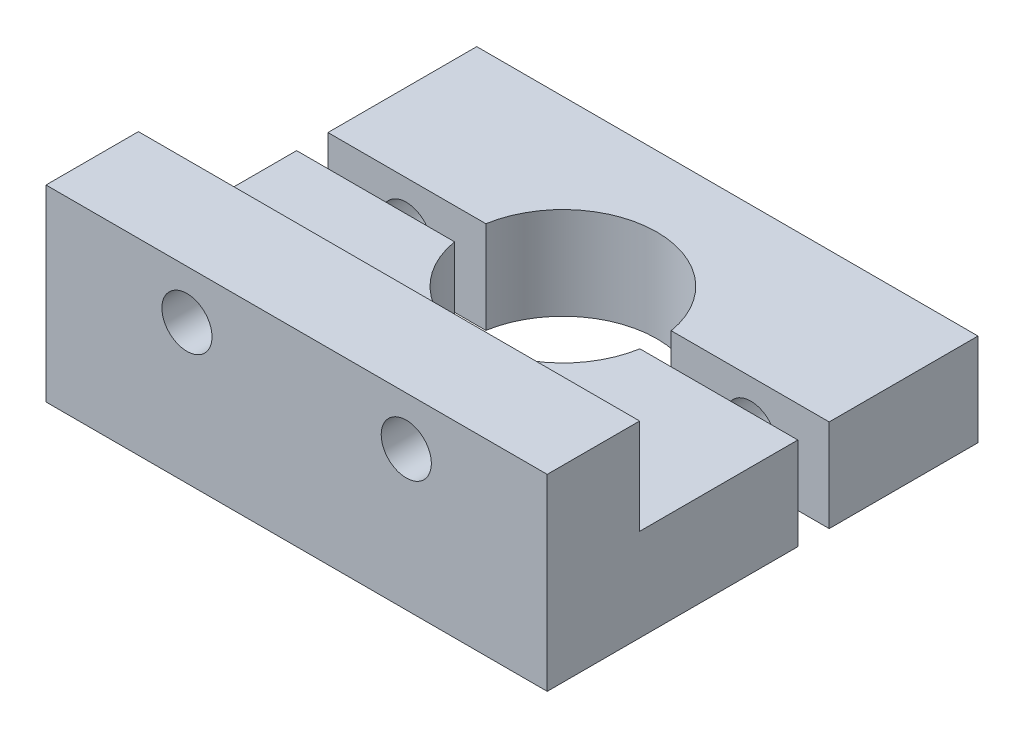
ISO-10303-21;
HEADER;
FILE_DESCRIPTION(('STEP AP214'),'2;1');
FILE_NAME('part.step','',(''),(''),'','','');
FILE_SCHEMA(('AUTOMOTIVE_DESIGN { 1 0 10303 214 1 1 1 1 }'));
ENDSEC;
DATA;
#1=APPLICATION_CONTEXT('core data for automotive mechanical design processes');
#2=APPLICATION_PROTOCOL_DEFINITION('international standard','automotive_design',2000,#1);
#3=PRODUCT_CONTEXT('',#1,'mechanical');
#4=PRODUCT('Part','Part','',(#3));
#5=PRODUCT_RELATED_PRODUCT_CATEGORY('part','',(#4));
#6=PRODUCT_DEFINITION_FORMATION('','',#4);
#7=PRODUCT_DEFINITION_CONTEXT('part definition',#1,'design');
#8=PRODUCT_DEFINITION('design','',#6,#7);
#9=PRODUCT_DEFINITION_SHAPE('','',#8);
#10=(LENGTH_UNIT() NAMED_UNIT(*) SI_UNIT(.MILLI.,.METRE.));
#11=(NAMED_UNIT(*) PLANE_ANGLE_UNIT() SI_UNIT($,.RADIAN.));
#12=(NAMED_UNIT(*) SI_UNIT($,.STERADIAN.) SOLID_ANGLE_UNIT());
#13=UNCERTAINTY_MEASURE_WITH_UNIT(LENGTH_MEASURE(1.E-05),#10,'distance_accuracy_value','');
#14=(GEOMETRIC_REPRESENTATION_CONTEXT(3) GLOBAL_UNCERTAINTY_ASSIGNED_CONTEXT((#13)) GLOBAL_UNIT_ASSIGNED_CONTEXT((#10,
#11,#12)) REPRESENTATION_CONTEXT('',''));
#15=CARTESIAN_POINT('',(0.,0.,0.));
#16=DIRECTION('',(0.,0.,1.));
#17=DIRECTION('',(1.,0.,0.));
#18=AXIS2_PLACEMENT_3D('',#15,#16,#17);
#19=CARTESIAN_POINT('',(0.,2.95,-17.));
#20=DIRECTION('',(0.,-1.,0.));
#21=DIRECTION('',(0.,0.,-1.));
#22=AXIS2_PLACEMENT_3D('',#19,#20,#21);
#23=CYLINDRICAL_SURFACE('',#22,6.);
#24=CARTESIAN_POINT('',(0.,-2.95,-17.));
#25=DIRECTION('',(0.,1.,0.));
#26=DIRECTION('',(0.,0.,1.));
#27=AXIS2_PLACEMENT_3D('',#24,#25,#26);
#28=CIRCLE('',#27,6.);
#29=CARTESIAN_POINT('',(5.91607978309962,-2.95,-18.));
#30=VERTEX_POINT('',#29);
#31=CARTESIAN_POINT('',(-5.91607978309962,-2.95,-18.));
#32=VERTEX_POINT('',#31);
#33=EDGE_CURVE('E135',#30,#32,#28,.T.);
#34=ORIENTED_EDGE('',*,*,#33,.F.);
#35=DIRECTION('',(0.,-1.,0.));
#36=VECTOR('',#35,1.);
#37=CARTESIAN_POINT('',(5.91607978309962,2.95,-18.));
#38=LINE('',#37,#36);
#39=CARTESIAN_POINT('',(5.91607978309962,2.95,-18.));
#40=VERTEX_POINT('',#39);
#41=EDGE_CURVE('E12',#40,#30,#38,.T.);
#42=ORIENTED_EDGE('',*,*,#41,.F.);
#43=CARTESIAN_POINT('',(0.,2.95,-17.));
#44=DIRECTION('',(0.,1.,0.));
#45=DIRECTION('',(0.,0.,1.));
#46=AXIS2_PLACEMENT_3D('',#43,#44,#45);
#47=CIRCLE('',#46,6.);
#48=CARTESIAN_POINT('',(-5.91607978309962,2.95,-18.));
#49=VERTEX_POINT('',#48);
#50=EDGE_CURVE('E161',#40,#49,#47,.T.);
#51=ORIENTED_EDGE('',*,*,#50,.T.);
#52=DIRECTION('',(0.,-1.,0.));
#53=VECTOR('',#52,1.);
#54=CARTESIAN_POINT('',(-5.91607978309962,2.95,-18.));
#55=LINE('',#54,#53);
#56=EDGE_CURVE('E69',#49,#32,#55,.T.);
#57=ORIENTED_EDGE('',*,*,#56,.T.);
#58=EDGE_LOOP('',(#34,#42,#51,#57));
#59=FACE_BOUND('',#58,.T.);
#60=ADVANCED_FACE('F52',(#59),#23,.F.);
#61=CARTESIAN_POINT('',(0.,2.95,-18.));
#62=DIRECTION('',(0.,0.,1.));
#63=DIRECTION('',(1.,0.,0.));
#64=AXIS2_PLACEMENT_3D('',#61,#62,#63);
#65=PLANE('',#64);
#66=CARTESIAN_POINT('',(11.,0.,-18.));
#67=DIRECTION('',(0.,0.,1.));
#68=DIRECTION('',(1.,0.,0.));
#69=AXIS2_PLACEMENT_3D('',#66,#67,#68);
#70=CIRCLE('',#69,1.6);
#71=CARTESIAN_POINT('',(12.6,0.,-18.));
#72=VERTEX_POINT('',#71);
#73=EDGE_CURVE('E138',#72,#72,#70,.T.);
#74=ORIENTED_EDGE('',*,*,#73,.F.);
#75=EDGE_LOOP('',(#74));
#76=FACE_BOUND('',#75,.T.);
#77=DIRECTION('',(-1.,0.,0.));
#78=VECTOR('',#77,1.);
#79=CARTESIAN_POINT('',(0.,-2.95,-18.));
#80=LINE('',#79,#78);
#81=CARTESIAN_POINT('',(16.0026293558523,-2.95,-18.));
#82=VERTEX_POINT('',#81);
#83=EDGE_CURVE('E137',#82,#30,#80,.T.);
#84=ORIENTED_EDGE('',*,*,#83,.F.);
#85=DIRECTION('',(0.,-1.,0.));
#86=VECTOR('',#85,1.);
#87=CARTESIAN_POINT('',(16.0026293558523,2.95,-18.));
#88=LINE('',#87,#86);
#89=CARTESIAN_POINT('',(16.0026293558523,2.95,-18.));
#90=VERTEX_POINT('',#89);
#91=EDGE_CURVE('E61',#90,#82,#88,.T.);
#92=ORIENTED_EDGE('',*,*,#91,.F.);
#93=DIRECTION('',(-1.,0.,0.));
#94=VECTOR('',#93,1.);
#95=CARTESIAN_POINT('',(0.,2.95,-18.));
#96=LINE('',#95,#94);
#97=EDGE_CURVE('E132',#90,#40,#96,.T.);
#98=ORIENTED_EDGE('',*,*,#97,.T.);
#99=ORIENTED_EDGE('',*,*,#41,.T.);
#100=EDGE_LOOP('',(#84,#92,#98,#99));
#101=FACE_BOUND('',#100,.T.);
#102=ADVANCED_FACE('F157',(#76,#101),#65,.T.);
#103=CARTESIAN_POINT('',(16.0026293558523,2.95,0.));
#104=DIRECTION('',(1.,0.,0.));
#105=DIRECTION('',(0.,0.,-1.));
#106=AXIS2_PLACEMENT_3D('',#103,#104,#105);
#107=PLANE('',#106);
#108=DIRECTION('',(0.,0.,1.));
#109=VECTOR('',#108,1.);
#110=CARTESIAN_POINT('',(16.0026293558523,-2.95,0.));
#111=LINE('',#110,#109);
#112=CARTESIAN_POINT('',(16.0026293558523,-2.95,-27.5));
#113=VERTEX_POINT('',#112);
#114=EDGE_CURVE('E141',#113,#82,#111,.T.);
#115=ORIENTED_EDGE('',*,*,#114,.F.);
#116=DIRECTION('',(0.,-1.,0.));
#117=VECTOR('',#116,1.);
#118=CARTESIAN_POINT('',(16.0026293558523,2.95,-27.5));
#119=LINE('',#118,#117);
#120=CARTESIAN_POINT('',(16.0026293558523,2.95,-27.5));
#121=VERTEX_POINT('',#120);
#122=EDGE_CURVE('E116',#121,#113,#119,.T.);
#123=ORIENTED_EDGE('',*,*,#122,.F.);
#124=DIRECTION('',(0.,0.,1.));
#125=VECTOR('',#124,1.);
#126=CARTESIAN_POINT('',(16.0026293558523,2.95,0.));
#127=LINE('',#126,#125);
#128=EDGE_CURVE('E126',#121,#90,#127,.T.);
#129=ORIENTED_EDGE('',*,*,#128,.T.);
#130=ORIENTED_EDGE('',*,*,#91,.T.);
#131=EDGE_LOOP('',(#115,#123,#129,#130));
#132=FACE_BOUND('',#131,.T.);
#133=ADVANCED_FACE('F154',(#132),#107,.T.);
#134=CARTESIAN_POINT('',(0.,2.95,-27.5));
#135=DIRECTION('',(0.,0.,-1.));
#136=DIRECTION('',(-1.,0.,0.));
#137=AXIS2_PLACEMENT_3D('',#134,#135,#136);
#138=PLANE('',#137);
#139=CARTESIAN_POINT('',(11.,0.,-27.5));
#140=DIRECTION('',(0.,0.,-1.));
#141=DIRECTION('',(-1.,0.,0.));
#142=AXIS2_PLACEMENT_3D('',#139,#140,#141);
#143=CIRCLE('',#142,1.6);
#144=CARTESIAN_POINT('',(9.4,0.,-27.5));
#145=VERTEX_POINT('',#144);
#146=EDGE_CURVE('E169',#145,#145,#143,.T.);
#147=ORIENTED_EDGE('',*,*,#146,.F.);
#148=EDGE_LOOP('',(#147));
#149=FACE_BOUND('',#148,.T.);
#150=CARTESIAN_POINT('',(-11.,0.,-27.5));
#151=DIRECTION('',(0.,0.,-1.));
#152=DIRECTION('',(1.,0.,0.));
#153=AXIS2_PLACEMENT_3D('',#150,#151,#152);
#154=CIRCLE('',#153,1.6);
#155=CARTESIAN_POINT('',(-9.4,0.,-27.5));
#156=VERTEX_POINT('',#155);
#157=EDGE_CURVE('E166',#156,#156,#154,.T.);
#158=ORIENTED_EDGE('',*,*,#157,.F.);
#159=EDGE_LOOP('',(#158));
#160=FACE_BOUND('',#159,.T.);
#161=DIRECTION('',(1.,0.,0.));
#162=VECTOR('',#161,1.);
#163=CARTESIAN_POINT('',(0.,-2.95,-27.5));
#164=LINE('',#163,#162);
#165=CARTESIAN_POINT('',(-16.,-2.95,-27.5));
#166=VERTEX_POINT('',#165);
#167=EDGE_CURVE('E112',#166,#113,#164,.T.);
#168=ORIENTED_EDGE('',*,*,#167,.F.);
#169=DIRECTION('',(0.,-1.,0.));
#170=VECTOR('',#169,1.);
#171=CARTESIAN_POINT('',(-16.,2.95,-27.5));
#172=LINE('',#171,#170);
#173=CARTESIAN_POINT('',(-16.,2.95,-27.5));
#174=VERTEX_POINT('',#173);
#175=EDGE_CURVE('E107',#174,#166,#172,.T.);
#176=ORIENTED_EDGE('',*,*,#175,.F.);
#177=DIRECTION('',(1.,0.,0.));
#178=VECTOR('',#177,1.);
#179=CARTESIAN_POINT('',(0.,2.95,-27.5));
#180=LINE('',#179,#178);
#181=EDGE_CURVE('E110',#174,#121,#180,.T.);
#182=ORIENTED_EDGE('',*,*,#181,.T.);
#183=ORIENTED_EDGE('',*,*,#122,.T.);
#184=EDGE_LOOP('',(#168,#176,#182,#183));
#185=FACE_BOUND('',#184,.T.);
#186=ADVANCED_FACE('F109',(#149,#160,#185),#138,.T.);
#187=CARTESIAN_POINT('',(-16.,2.95,0.));
#188=DIRECTION('',(-1.,0.,0.));
#189=DIRECTION('',(0.,0.,1.));
#190=AXIS2_PLACEMENT_3D('',#187,#188,#189);
#191=PLANE('',#190);
#192=DIRECTION('',(0.,0.,-1.));
#193=VECTOR('',#192,1.);
#194=CARTESIAN_POINT('',(-16.,-2.95,0.));
#195=LINE('',#194,#193);
#196=CARTESIAN_POINT('',(-16.,-2.95,-18.));
#197=VERTEX_POINT('',#196);
#198=EDGE_CURVE('E146',#197,#166,#195,.T.);
#199=ORIENTED_EDGE('',*,*,#198,.F.);
#200=DIRECTION('',(0.,-1.,0.));
#201=VECTOR('',#200,1.);
#202=CARTESIAN_POINT('',(-16.,2.95,-18.));
#203=LINE('',#202,#201);
#204=CARTESIAN_POINT('',(-16.,2.95,-18.));
#205=VERTEX_POINT('',#204);
#206=EDGE_CURVE('E88',#205,#197,#203,.T.);
#207=ORIENTED_EDGE('',*,*,#206,.F.);
#208=DIRECTION('',(0.,0.,-1.));
#209=VECTOR('',#208,1.);
#210=CARTESIAN_POINT('',(-16.,2.95,0.));
#211=LINE('',#210,#209);
#212=EDGE_CURVE('E123',#205,#174,#211,.T.);
#213=ORIENTED_EDGE('',*,*,#212,.T.);
#214=ORIENTED_EDGE('',*,*,#175,.T.);
#215=EDGE_LOOP('',(#199,#207,#213,#214));
#216=FACE_BOUND('',#215,.T.);
#217=ADVANCED_FACE('F128',(#216),#191,.T.);
#218=CARTESIAN_POINT('',(-11.,0.,-18.));
#219=DIRECTION('',(0.,0.,1.));
#220=DIRECTION('',(1.,0.,0.));
#221=AXIS2_PLACEMENT_3D('',#218,#219,#220);
#222=CIRCLE('',#221,1.6);
#223=CARTESIAN_POINT('',(-9.4,0.,-18.));
#224=VERTEX_POINT('',#223);
#225=EDGE_CURVE('E55',#224,#224,#222,.T.);
#226=ORIENTED_EDGE('',*,*,#225,.F.);
#227=EDGE_LOOP('',(#226));
#228=FACE_BOUND('',#227,.T.);
#229=EDGE_CURVE('E142',#32,#197,#80,.T.);
#230=ORIENTED_EDGE('',*,*,#229,.F.);
#231=ORIENTED_EDGE('',*,*,#56,.F.);
#232=EDGE_CURVE('E129',#49,#205,#96,.T.);
#233=ORIENTED_EDGE('',*,*,#232,.T.);
#234=ORIENTED_EDGE('',*,*,#206,.T.);
#235=EDGE_LOOP('',(#230,#231,#233,#234));
#236=FACE_BOUND('',#235,.T.);
#237=ADVANCED_FACE('F179',(#228,#236),#65,.T.);
#238=CARTESIAN_POINT('',(0.,2.95,0.));
#239=DIRECTION('',(0.,1.,0.));
#240=DIRECTION('',(0.,0.,1.));
#241=AXIS2_PLACEMENT_3D('',#238,#239,#240);
#242=PLANE('',#241);
#243=ORIENTED_EDGE('',*,*,#50,.F.);
#244=ORIENTED_EDGE('',*,*,#97,.F.);
#245=ORIENTED_EDGE('',*,*,#128,.F.);
#246=ORIENTED_EDGE('',*,*,#181,.F.);
#247=ORIENTED_EDGE('',*,*,#212,.F.);
#248=ORIENTED_EDGE('',*,*,#232,.F.);
#249=EDGE_LOOP('',(#243,#244,#245,#246,#247,#248));
#250=FACE_BOUND('',#249,.T.);
#251=ADVANCED_FACE('F121',(#250),#242,.T.);
#252=CARTESIAN_POINT('',(0.,-2.95,0.));
#253=DIRECTION('',(0.,1.,0.));
#254=DIRECTION('',(0.,0.,1.));
#255=AXIS2_PLACEMENT_3D('',#252,#253,#254);
#256=PLANE('',#255);
#257=ORIENTED_EDGE('',*,*,#33,.T.);
#258=ORIENTED_EDGE('',*,*,#229,.T.);
#259=ORIENTED_EDGE('',*,*,#198,.T.);
#260=ORIENTED_EDGE('',*,*,#167,.T.);
#261=ORIENTED_EDGE('',*,*,#114,.T.);
#262=ORIENTED_EDGE('',*,*,#83,.T.);
#263=EDGE_LOOP('',(#257,#258,#259,#260,#261,#262));
#264=FACE_BOUND('',#263,.T.);
#265=ADVANCED_FACE('F159',(#264),#256,.F.);
#266=CARTESIAN_POINT('',(-11.,0.,-10.));
#267=DIRECTION('',(0.,0.,-1.));
#268=DIRECTION('',(-1.,0.,0.));
#269=AXIS2_PLACEMENT_3D('',#266,#267,#268);
#270=CYLINDRICAL_SURFACE('',#269,1.6);
#271=ORIENTED_EDGE('',*,*,#225,.T.);
#272=EDGE_LOOP('',(#271));
#273=FACE_BOUND('',#272,.T.);
#274=ORIENTED_EDGE('',*,*,#157,.T.);
#275=EDGE_LOOP('',(#274));
#276=FACE_BOUND('',#275,.T.);
#277=ADVANCED_FACE('F176',(#273,#276),#270,.F.);
#278=CARTESIAN_POINT('',(11.,0.,-10.));
#279=DIRECTION('',(0.,0.,-1.));
#280=DIRECTION('',(-1.,0.,0.));
#281=AXIS2_PLACEMENT_3D('',#278,#279,#280);
#282=CYLINDRICAL_SURFACE('',#281,1.6);
#283=ORIENTED_EDGE('',*,*,#73,.T.);
#284=EDGE_LOOP('',(#283));
#285=FACE_BOUND('',#284,.T.);
#286=ORIENTED_EDGE('',*,*,#146,.T.);
#287=EDGE_LOOP('',(#286));
#288=FACE_BOUND('',#287,.T.);
#289=ADVANCED_FACE('F240',(#285,#288),#282,.F.);
#290=CLOSED_SHELL('',(#60,#102,#133,#186,#217,#237,#251,#265,#277,#289));
#291=MANIFOLD_SOLID_BREP('B2',#290);
#292=CARTESIAN_POINT('',(0.,2.95,-17.));
#293=DIRECTION('',(0.,-1.,0.));
#294=DIRECTION('',(0.,0.,-1.));
#295=AXIS2_PLACEMENT_3D('',#292,#293,#294);
#296=CYLINDRICAL_SURFACE('',#295,6.);
#297=CARTESIAN_POINT('',(0.,-2.95,-17.));
#298=DIRECTION('',(0.,1.,0.));
#299=DIRECTION('',(0.,0.,1.));
#300=AXIS2_PLACEMENT_3D('',#297,#298,#299);
#301=CIRCLE('',#300,6.);
#302=CARTESIAN_POINT('',(-5.91607978309962,-2.95,-16.));
#303=VERTEX_POINT('',#302);
#304=CARTESIAN_POINT('',(5.91607978309962,-2.95,-16.));
#305=VERTEX_POINT('',#304);
#306=EDGE_CURVE('E411',#303,#305,#301,.T.);
#307=ORIENTED_EDGE('',*,*,#306,.F.);
#308=DIRECTION('',(0.,-1.,0.));
#309=VECTOR('',#308,1.);
#310=CARTESIAN_POINT('',(-5.91607978309962,2.95,-16.));
#311=LINE('',#310,#309);
#312=CARTESIAN_POINT('',(-5.91607978309962,2.95,-16.));
#313=VERTEX_POINT('',#312);
#314=EDGE_CURVE('E50',#313,#303,#311,.T.);
#315=ORIENTED_EDGE('',*,*,#314,.F.);
#316=CARTESIAN_POINT('',(0.,2.95,-17.));
#317=DIRECTION('',(0.,1.,0.));
#318=DIRECTION('',(0.,0.,1.));
#319=AXIS2_PLACEMENT_3D('',#316,#317,#318);
#320=CIRCLE('',#319,6.);
#321=CARTESIAN_POINT('',(5.91607978309962,2.95,-16.));
#322=VERTEX_POINT('',#321);
#323=EDGE_CURVE('E401',#313,#322,#320,.T.);
#324=ORIENTED_EDGE('',*,*,#323,.T.);
#325=DIRECTION('',(0.,-1.,0.));
#326=VECTOR('',#325,1.);
#327=CARTESIAN_POINT('',(5.91607978309962,2.95,-16.));
#328=LINE('',#327,#326);
#329=EDGE_CURVE('E335',#322,#305,#328,.T.);
#330=ORIENTED_EDGE('',*,*,#329,.T.);
#331=EDGE_LOOP('',(#307,#315,#324,#330));
#332=FACE_BOUND('',#331,.T.);
#333=ADVANCED_FACE('F286',(#332),#296,.F.);
#334=CARTESIAN_POINT('',(0.,2.95,-16.));
#335=DIRECTION('',(0.,0.,1.));
#336=DIRECTION('',(1.,0.,0.));
#337=AXIS2_PLACEMENT_3D('',#334,#335,#336);
#338=PLANE('',#337);
#339=CARTESIAN_POINT('',(-11.,0.,-16.));
#340=DIRECTION('',(0.,0.,1.));
#341=DIRECTION('',(1.,0.,0.));
#342=AXIS2_PLACEMENT_3D('',#339,#340,#341);
#343=CIRCLE('',#342,1.6);
#344=CARTESIAN_POINT('',(-9.4,0.,-16.));
#345=VERTEX_POINT('',#344);
#346=EDGE_CURVE('E289',#345,#345,#343,.T.);
#347=ORIENTED_EDGE('',*,*,#346,.T.);
#348=EDGE_LOOP('',(#347));
#349=FACE_BOUND('',#348,.T.);
#350=DIRECTION('',(-1.,0.,0.));
#351=VECTOR('',#350,1.);
#352=CARTESIAN_POINT('',(0.,-2.95,-16.));
#353=LINE('',#352,#351);
#354=CARTESIAN_POINT('',(-16.,-2.95,-16.));
#355=VERTEX_POINT('',#354);
#356=EDGE_CURVE('E414',#303,#355,#353,.T.);
#357=ORIENTED_EDGE('',*,*,#356,.T.);
#358=DIRECTION('',(0.,-1.,0.));
#359=VECTOR('',#358,1.);
#360=CARTESIAN_POINT('',(-16.,2.95,-16.));
#361=LINE('',#360,#359);
#362=CARTESIAN_POINT('',(-16.,2.95,-16.));
#363=VERTEX_POINT('',#362);
#364=EDGE_CURVE('E294',#363,#355,#361,.T.);
#365=ORIENTED_EDGE('',*,*,#364,.F.);
#366=DIRECTION('',(-1.,0.,0.));
#367=VECTOR('',#366,1.);
#368=CARTESIAN_POINT('',(0.,2.95,-16.));
#369=LINE('',#368,#367);
#370=EDGE_CURVE('E403',#313,#363,#369,.T.);
#371=ORIENTED_EDGE('',*,*,#370,.F.);
#372=ORIENTED_EDGE('',*,*,#314,.T.);
#373=EDGE_LOOP('',(#357,#365,#371,#372));
#374=FACE_BOUND('',#373,.T.);
#375=ADVANCED_FACE('F433',(#349,#374),#338,.F.);
#376=CARTESIAN_POINT('',(-16.,2.95,0.));
#377=DIRECTION('',(-1.,0.,0.));
#378=DIRECTION('',(0.,0.,1.));
#379=AXIS2_PLACEMENT_3D('',#376,#377,#378);
#380=PLANE('',#379);
#381=DIRECTION('',(0.,0.,-1.));
#382=VECTOR('',#381,1.);
#383=CARTESIAN_POINT('',(-16.,-2.95,0.));
#384=LINE('',#383,#382);
#385=CARTESIAN_POINT('',(-16.,-2.95,0.));
#386=VERTEX_POINT('',#385);
#387=EDGE_CURVE('E364',#386,#355,#384,.T.);
#388=ORIENTED_EDGE('',*,*,#387,.F.);
#389=DIRECTION('',(0.,-1.,0.));
#390=VECTOR('',#389,1.);
#391=CARTESIAN_POINT('',(-16.,2.95,0.));
#392=LINE('',#391,#390);
#393=CARTESIAN_POINT('',(-16.,9.05,0.));
#394=VERTEX_POINT('',#393);
#395=EDGE_CURVE('E357',#394,#386,#392,.T.);
#396=ORIENTED_EDGE('',*,*,#395,.F.);
#397=DIRECTION('',(0.,0.,1.));
#398=VECTOR('',#397,1.);
#399=CARTESIAN_POINT('',(-16.,9.05,0.));
#400=LINE('',#399,#398);
#401=CARTESIAN_POINT('',(-16.,9.05,-5.9));
#402=VERTEX_POINT('',#401);
#403=EDGE_CURVE('E362',#402,#394,#400,.T.);
#404=ORIENTED_EDGE('',*,*,#403,.F.);
#405=DIRECTION('',(0.,-1.,0.));
#406=VECTOR('',#405,1.);
#407=CARTESIAN_POINT('',(-16.,9.05,-5.9));
#408=LINE('',#407,#406);
#409=CARTESIAN_POINT('',(-16.,2.95,-5.9));
#410=VERTEX_POINT('',#409);
#411=EDGE_CURVE('E388',#402,#410,#408,.T.);
#412=ORIENTED_EDGE('',*,*,#411,.T.);
#413=DIRECTION('',(0.,0.,-1.));
#414=VECTOR('',#413,1.);
#415=CARTESIAN_POINT('',(-16.,2.95,0.));
#416=LINE('',#415,#414);
#417=EDGE_CURVE('E407',#410,#363,#416,.T.);
#418=ORIENTED_EDGE('',*,*,#417,.T.);
#419=ORIENTED_EDGE('',*,*,#364,.T.);
#420=EDGE_LOOP('',(#388,#396,#404,#412,#418,#419));
#421=FACE_BOUND('',#420,.T.);
#422=ADVANCED_FACE('F359',(#421),#380,.T.);
#423=CARTESIAN_POINT('',(0.,2.95,0.));
#424=DIRECTION('',(0.,0.,-1.));
#425=DIRECTION('',(-1.,0.,0.));
#426=AXIS2_PLACEMENT_3D('',#423,#424,#425);
#427=PLANE('',#426);
#428=CARTESIAN_POINT('',(7.,5.95,0.));
#429=DIRECTION('',(0.,0.,-1.));
#430=DIRECTION('',(-1.,0.,0.));
#431=AXIS2_PLACEMENT_3D('',#428,#429,#430);
#432=CIRCLE('',#431,1.6);
#433=CARTESIAN_POINT('',(5.4,5.95,0.));
#434=VERTEX_POINT('',#433);
#435=EDGE_CURVE('E382',#434,#434,#432,.T.);
#436=ORIENTED_EDGE('',*,*,#435,.T.);
#437=EDGE_LOOP('',(#436));
#438=FACE_BOUND('',#437,.T.);
#439=CARTESIAN_POINT('',(-7.,5.95,0.));
#440=DIRECTION('',(0.,0.,-1.));
#441=DIRECTION('',(-1.,0.,0.));
#442=AXIS2_PLACEMENT_3D('',#439,#440,#441);
#443=CIRCLE('',#442,1.6);
#444=CARTESIAN_POINT('',(-8.6,5.95,0.));
#445=VERTEX_POINT('',#444);
#446=EDGE_CURVE('E634',#445,#445,#443,.T.);
#447=ORIENTED_EDGE('',*,*,#446,.T.);
#448=EDGE_LOOP('',(#447));
#449=FACE_BOUND('',#448,.T.);
#450=DIRECTION('',(1.,0.,0.));
#451=VECTOR('',#450,1.);
#452=CARTESIAN_POINT('',(0.,-2.95,0.));
#453=LINE('',#452,#451);
#454=CARTESIAN_POINT('',(16.,-2.95,0.));
#455=VERTEX_POINT('',#454);
#456=EDGE_CURVE('E418',#386,#455,#453,.T.);
#457=ORIENTED_EDGE('',*,*,#456,.T.);
#458=DIRECTION('',(0.,-1.,0.));
#459=VECTOR('',#458,1.);
#460=CARTESIAN_POINT('',(16.,2.95,0.));
#461=LINE('',#460,#459);
#462=CARTESIAN_POINT('',(16.,9.05,0.));
#463=VERTEX_POINT('',#462);
#464=EDGE_CURVE('E367',#463,#455,#461,.T.);
#465=ORIENTED_EDGE('',*,*,#464,.F.);
#466=DIRECTION('',(1.,0.,0.));
#467=VECTOR('',#466,1.);
#468=CARTESIAN_POINT('',(16.,9.05,0.));
#469=LINE('',#468,#467);
#470=EDGE_CURVE('E370',#394,#463,#469,.T.);
#471=ORIENTED_EDGE('',*,*,#470,.F.);
#472=ORIENTED_EDGE('',*,*,#395,.T.);
#473=EDGE_LOOP('',(#457,#465,#471,#472));
#474=FACE_BOUND('',#473,.T.);
#475=ADVANCED_FACE('F371',(#438,#449,#474),#427,.F.);
#476=CARTESIAN_POINT('',(16.,2.95,0.));
#477=DIRECTION('',(-1.,0.,0.));
#478=DIRECTION('',(0.,0.,1.));
#479=AXIS2_PLACEMENT_3D('',#476,#477,#478);
#480=PLANE('',#479);
#481=DIRECTION('',(0.,0.,-1.));
#482=VECTOR('',#481,1.);
#483=CARTESIAN_POINT('',(16.,-2.95,0.));
#484=LINE('',#483,#482);
#485=CARTESIAN_POINT('',(16.,-2.95,-16.));
#486=VERTEX_POINT('',#485);
#487=EDGE_CURVE('E420',#455,#486,#484,.T.);
#488=ORIENTED_EDGE('',*,*,#487,.T.);
#489=DIRECTION('',(0.,-1.,0.));
#490=VECTOR('',#489,1.);
#491=CARTESIAN_POINT('',(16.,2.95,-16.));
#492=LINE('',#491,#490);
#493=CARTESIAN_POINT('',(16.,2.95,-16.));
#494=VERTEX_POINT('',#493);
#495=EDGE_CURVE('E423',#494,#486,#492,.T.);
#496=ORIENTED_EDGE('',*,*,#495,.F.);
#497=DIRECTION('',(0.,0.,-1.));
#498=VECTOR('',#497,1.);
#499=CARTESIAN_POINT('',(16.,2.95,0.));
#500=LINE('',#499,#498);
#501=CARTESIAN_POINT('',(16.,2.95,-5.9));
#502=VERTEX_POINT('',#501);
#503=EDGE_CURVE('E409',#502,#494,#500,.T.);
#504=ORIENTED_EDGE('',*,*,#503,.F.);
#505=DIRECTION('',(0.,-1.,0.));
#506=VECTOR('',#505,1.);
#507=CARTESIAN_POINT('',(16.,9.05,-5.9));
#508=LINE('',#507,#506);
#509=CARTESIAN_POINT('',(16.,9.05,-5.9));
#510=VERTEX_POINT('',#509);
#511=EDGE_CURVE('E391',#510,#502,#508,.T.);
#512=ORIENTED_EDGE('',*,*,#511,.F.);
#513=DIRECTION('',(0.,0.,-1.));
#514=VECTOR('',#513,1.);
#515=CARTESIAN_POINT('',(16.,9.05,-5.9));
#516=LINE('',#515,#514);
#517=EDGE_CURVE('E375',#463,#510,#516,.T.);
#518=ORIENTED_EDGE('',*,*,#517,.F.);
#519=ORIENTED_EDGE('',*,*,#464,.T.);
#520=EDGE_LOOP('',(#488,#496,#504,#512,#518,#519));
#521=FACE_BOUND('',#520,.T.);
#522=ADVANCED_FACE('F474',(#521),#480,.F.);
#523=CARTESIAN_POINT('',(11.,0.,-16.));
#524=DIRECTION('',(0.,0.,1.));
#525=DIRECTION('',(1.,0.,0.));
#526=AXIS2_PLACEMENT_3D('',#523,#524,#525);
#527=CIRCLE('',#526,1.6);
#528=CARTESIAN_POINT('',(12.6,0.,-16.));
#529=VERTEX_POINT('',#528);
#530=EDGE_CURVE('E398',#529,#529,#527,.T.);
#531=ORIENTED_EDGE('',*,*,#530,.T.);
#532=EDGE_LOOP('',(#531));
#533=FACE_BOUND('',#532,.T.);
#534=EDGE_CURVE('E404',#486,#305,#353,.T.);
#535=ORIENTED_EDGE('',*,*,#534,.T.);
#536=ORIENTED_EDGE('',*,*,#329,.F.);
#537=EDGE_CURVE('E309',#494,#322,#369,.T.);
#538=ORIENTED_EDGE('',*,*,#537,.F.);
#539=ORIENTED_EDGE('',*,*,#495,.T.);
#540=EDGE_LOOP('',(#535,#536,#538,#539));
#541=FACE_BOUND('',#540,.T.);
#542=ADVANCED_FACE('F459',(#533,#541),#338,.F.);
#543=CARTESIAN_POINT('',(0.,2.95,0.));
#544=DIRECTION('',(0.,1.,0.));
#545=DIRECTION('',(0.,0.,1.));
#546=AXIS2_PLACEMENT_3D('',#543,#544,#545);
#547=PLANE('',#546);
#548=DIRECTION('',(-1.,0.,0.));
#549=VECTOR('',#548,1.);
#550=CARTESIAN_POINT('',(-16.,2.95,-5.9));
#551=LINE('',#550,#549);
#552=EDGE_CURVE('E302',#502,#410,#551,.T.);
#553=ORIENTED_EDGE('',*,*,#552,.F.);
#554=ORIENTED_EDGE('',*,*,#503,.T.);
#555=ORIENTED_EDGE('',*,*,#537,.T.);
#556=ORIENTED_EDGE('',*,*,#323,.F.);
#557=ORIENTED_EDGE('',*,*,#370,.T.);
#558=ORIENTED_EDGE('',*,*,#417,.F.);
#559=EDGE_LOOP('',(#553,#554,#555,#556,#557,#558));
#560=FACE_BOUND('',#559,.T.);
#561=ADVANCED_FACE('F466',(#560),#547,.T.);
#562=CARTESIAN_POINT('',(0.,-2.95,0.));
#563=DIRECTION('',(0.,1.,0.));
#564=DIRECTION('',(0.,0.,1.));
#565=AXIS2_PLACEMENT_3D('',#562,#563,#564);
#566=PLANE('',#565);
#567=ORIENTED_EDGE('',*,*,#306,.T.);
#568=ORIENTED_EDGE('',*,*,#534,.F.);
#569=ORIENTED_EDGE('',*,*,#487,.F.);
#570=ORIENTED_EDGE('',*,*,#456,.F.);
#571=ORIENTED_EDGE('',*,*,#387,.T.);
#572=ORIENTED_EDGE('',*,*,#356,.F.);
#573=EDGE_LOOP('',(#567,#568,#569,#570,#571,#572));
#574=FACE_BOUND('',#573,.T.);
#575=ADVANCED_FACE('F463',(#574),#566,.F.);
#576=CARTESIAN_POINT('',(11.,0.,-10.));
#577=DIRECTION('',(0.,0.,-1.));
#578=DIRECTION('',(-1.,0.,0.));
#579=AXIS2_PLACEMENT_3D('',#576,#577,#578);
#580=CYLINDRICAL_SURFACE('',#579,1.6);
#581=CARTESIAN_POINT('',(11.,0.,-10.));
#582=DIRECTION('',(0.,0.,-1.));
#583=DIRECTION('',(-1.,0.,0.));
#584=AXIS2_PLACEMENT_3D('',#581,#582,#583);
#585=CIRCLE('',#584,1.6);
#586=CARTESIAN_POINT('',(9.4,0.,-10.));
#587=VERTEX_POINT('',#586);
#588=EDGE_CURVE('E395',#587,#587,#585,.T.);
#589=ORIENTED_EDGE('',*,*,#588,.F.);
#590=EDGE_LOOP('',(#589));
#591=FACE_BOUND('',#590,.T.);
#592=ORIENTED_EDGE('',*,*,#530,.F.);
#593=EDGE_LOOP('',(#592));
#594=FACE_BOUND('',#593,.T.);
#595=ADVANCED_FACE('F449',(#591,#594),#580,.F.);
#596=CARTESIAN_POINT('',(11.,0.,-10.));
#597=DIRECTION('',(0.,0.,-1.));
#598=DIRECTION('',(-1.,0.,0.));
#599=AXIS2_PLACEMENT_3D('',#596,#597,#598);
#600=PLANE('',#599);
#601=ORIENTED_EDGE('',*,*,#588,.T.);
#602=EDGE_LOOP('',(#601));
#603=FACE_BOUND('',#602,.T.);
#604=ADVANCED_FACE('F439',(#603),#600,.T.);
#605=CARTESIAN_POINT('',(-11.,0.,-10.));
#606=DIRECTION('',(0.,0.,-1.));
#607=DIRECTION('',(-1.,0.,0.));
#608=AXIS2_PLACEMENT_3D('',#605,#606,#607);
#609=CYLINDRICAL_SURFACE('',#608,1.6);
#610=CARTESIAN_POINT('',(-11.,0.,-10.));
#611=DIRECTION('',(0.,0.,-1.));
#612=DIRECTION('',(1.,0.,0.));
#613=AXIS2_PLACEMENT_3D('',#610,#611,#612);
#614=CIRCLE('',#613,1.6);
#615=CARTESIAN_POINT('',(-9.4,0.,-10.));
#616=VERTEX_POINT('',#615);
#617=EDGE_CURVE('E394',#616,#616,#614,.T.);
#618=ORIENTED_EDGE('',*,*,#617,.F.);
#619=EDGE_LOOP('',(#618));
#620=FACE_BOUND('',#619,.T.);
#621=ORIENTED_EDGE('',*,*,#346,.F.);
#622=EDGE_LOOP('',(#621));
#623=FACE_BOUND('',#622,.T.);
#624=ADVANCED_FACE('F436',(#620,#623),#609,.F.);
#625=CARTESIAN_POINT('',(-11.,0.,-10.));
#626=DIRECTION('',(0.,0.,1.));
#627=DIRECTION('',(1.,0.,0.));
#628=AXIS2_PLACEMENT_3D('',#625,#626,#627);
#629=PLANE('',#628);
#630=ORIENTED_EDGE('',*,*,#617,.T.);
#631=EDGE_LOOP('',(#630));
#632=FACE_BOUND('',#631,.T.);
#633=ADVANCED_FACE('F438',(#632),#629,.F.);
#634=CARTESIAN_POINT('',(-16.,9.05,-5.9));
#635=DIRECTION('',(0.,0.,1.));
#636=DIRECTION('',(1.,0.,0.));
#637=AXIS2_PLACEMENT_3D('',#634,#635,#636);
#638=PLANE('',#637);
#639=CARTESIAN_POINT('',(7.,5.95,-5.9));
#640=DIRECTION('',(0.,0.,-1.));
#641=DIRECTION('',(-1.,0.,0.));
#642=AXIS2_PLACEMENT_3D('',#639,#640,#641);
#643=CIRCLE('',#642,1.6);
#644=CARTESIAN_POINT('',(5.4,5.95,-5.9));
#645=VERTEX_POINT('',#644);
#646=EDGE_CURVE('E631',#645,#645,#643,.T.);
#647=ORIENTED_EDGE('',*,*,#646,.F.);
#648=EDGE_LOOP('',(#647));
#649=FACE_BOUND('',#648,.T.);
#650=CARTESIAN_POINT('',(-7.,5.95,-5.9));
#651=DIRECTION('',(0.,0.,-1.));
#652=DIRECTION('',(1.,0.,0.));
#653=AXIS2_PLACEMENT_3D('',#650,#651,#652);
#654=CIRCLE('',#653,1.6);
#655=CARTESIAN_POINT('',(-5.4,5.95,-5.9));
#656=VERTEX_POINT('',#655);
#657=EDGE_CURVE('E638',#656,#656,#654,.T.);
#658=ORIENTED_EDGE('',*,*,#657,.F.);
#659=EDGE_LOOP('',(#658));
#660=FACE_BOUND('',#659,.T.);
#661=ORIENTED_EDGE('',*,*,#552,.T.);
#662=ORIENTED_EDGE('',*,*,#411,.F.);
#663=DIRECTION('',(-1.,0.,0.));
#664=VECTOR('',#663,1.);
#665=CARTESIAN_POINT('',(-16.,9.05,-5.9));
#666=LINE('',#665,#664);
#667=EDGE_CURVE('E379',#510,#402,#666,.T.);
#668=ORIENTED_EDGE('',*,*,#667,.F.);
#669=ORIENTED_EDGE('',*,*,#511,.T.);
#670=EDGE_LOOP('',(#661,#662,#668,#669));
#671=FACE_BOUND('',#670,.T.);
#672=ADVANCED_FACE('F446',(#649,#660,#671),#638,.F.);
#673=CARTESIAN_POINT('',(0.,9.05,0.));
#674=DIRECTION('',(0.,-1.,0.));
#675=DIRECTION('',(0.,0.,-1.));
#676=AXIS2_PLACEMENT_3D('',#673,#674,#675);
#677=PLANE('',#676);
#678=ORIENTED_EDGE('',*,*,#403,.T.);
#679=ORIENTED_EDGE('',*,*,#470,.T.);
#680=ORIENTED_EDGE('',*,*,#517,.T.);
#681=ORIENTED_EDGE('',*,*,#667,.T.);
#682=EDGE_LOOP('',(#678,#679,#680,#681));
#683=FACE_BOUND('',#682,.T.);
#684=ADVANCED_FACE('F377',(#683),#677,.F.);
#685=CARTESIAN_POINT('',(-7.,5.95,0.200000000000002));
#686=DIRECTION('',(0.,0.,-1.));
#687=DIRECTION('',(-1.,0.,0.));
#688=AXIS2_PLACEMENT_3D('',#685,#686,#687);
#689=CYLINDRICAL_SURFACE('',#688,1.6);
#690=ORIENTED_EDGE('',*,*,#657,.T.);
#691=EDGE_LOOP('',(#690));
#692=FACE_BOUND('',#691,.T.);
#693=ORIENTED_EDGE('',*,*,#446,.F.);
#694=EDGE_LOOP('',(#693));
#695=FACE_BOUND('',#694,.T.);
#696=ADVANCED_FACE('F549',(#692,#695),#689,.F.);
#697=CARTESIAN_POINT('',(7.,5.95,0.200000000000002));
#698=DIRECTION('',(0.,0.,-1.));
#699=DIRECTION('',(-1.,0.,0.));
#700=AXIS2_PLACEMENT_3D('',#697,#698,#699);
#701=CYLINDRICAL_SURFACE('',#700,1.6);
#702=ORIENTED_EDGE('',*,*,#646,.T.);
#703=EDGE_LOOP('',(#702));
#704=FACE_BOUND('',#703,.T.);
#705=ORIENTED_EDGE('',*,*,#435,.F.);
#706=EDGE_LOOP('',(#705));
#707=FACE_BOUND('',#706,.T.);
#708=ADVANCED_FACE('F555',(#704,#707),#701,.F.);
#709=CLOSED_SHELL('',(#333,#375,#422,#475,#522,#542,#561,#575,#595,#604,#624,#633,#672,#684,
#696,#708));
#710=MANIFOLD_SOLID_BREP('B6',#709);
#711=ADVANCED_BREP_SHAPE_REPRESENTATION('',(#18,#291,#710),#14);
#712=SHAPE_DEFINITION_REPRESENTATION(#9,#711);
ENDSEC;
END-ISO-10303-21;
